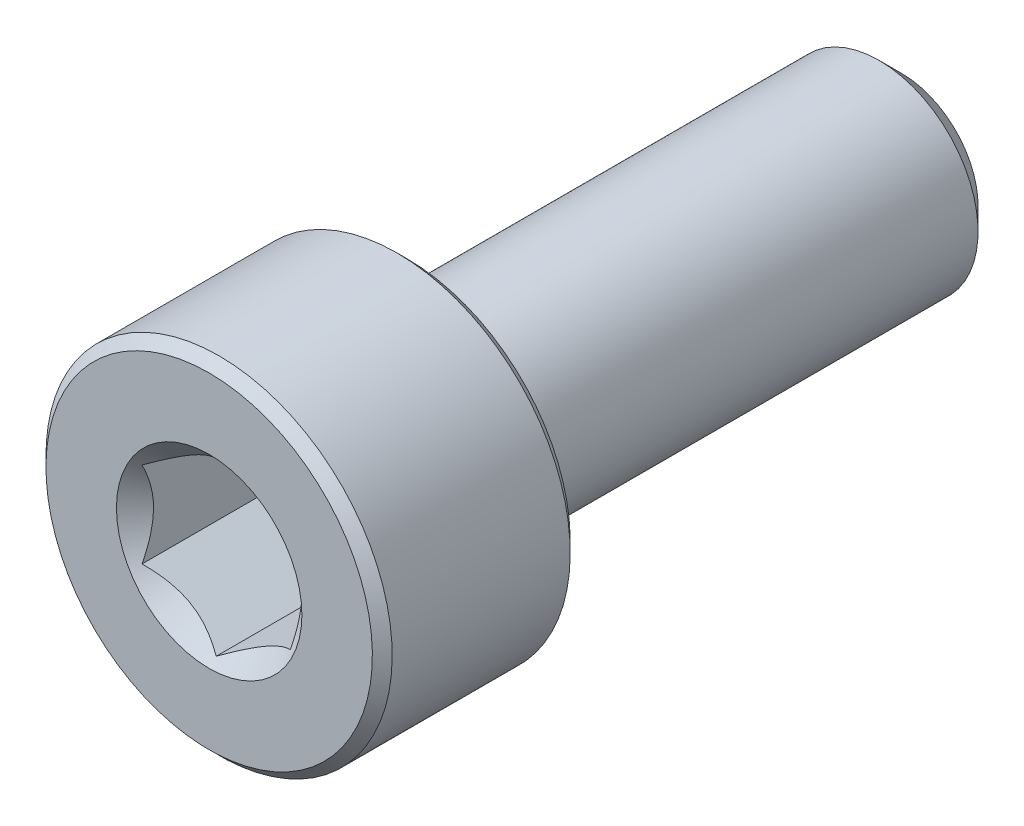
ISO-10303-21;
HEADER;
FILE_DESCRIPTION(('STEP AP214'),'2;1');
FILE_NAME('part.step','',(''),(''),'','','');
FILE_SCHEMA(('AUTOMOTIVE_DESIGN { 1 0 10303 214 1 1 1 1 }'));
ENDSEC;
DATA;
#1=APPLICATION_CONTEXT('core data for automotive mechanical design processes');
#2=APPLICATION_PROTOCOL_DEFINITION('international standard','automotive_design',2000,#1);
#3=PRODUCT_CONTEXT('',#1,'mechanical');
#4=PRODUCT('Part','Part','',(#3));
#5=PRODUCT_RELATED_PRODUCT_CATEGORY('part','',(#4));
#6=PRODUCT_DEFINITION_FORMATION('','',#4);
#7=PRODUCT_DEFINITION_CONTEXT('part definition',#1,'design');
#8=PRODUCT_DEFINITION('design','',#6,#7);
#9=PRODUCT_DEFINITION_SHAPE('','',#8);
#10=(LENGTH_UNIT() NAMED_UNIT(*) SI_UNIT(.MILLI.,.METRE.));
#11=(NAMED_UNIT(*) PLANE_ANGLE_UNIT() SI_UNIT($,.RADIAN.));
#12=(NAMED_UNIT(*) SI_UNIT($,.STERADIAN.) SOLID_ANGLE_UNIT());
#13=UNCERTAINTY_MEASURE_WITH_UNIT(LENGTH_MEASURE(1.E-05),#10,'distance_accuracy_value','');
#14=(GEOMETRIC_REPRESENTATION_CONTEXT(3) GLOBAL_UNCERTAINTY_ASSIGNED_CONTEXT((#13)) GLOBAL_UNIT_ASSIGNED_CONTEXT((#10,
#11,#12)) REPRESENTATION_CONTEXT('',''));
#15=CARTESIAN_POINT('',(0.,0.,0.));
#16=DIRECTION('',(0.,0.,1.));
#17=DIRECTION('',(1.,0.,0.));
#18=AXIS2_PLACEMENT_3D('',#15,#16,#17);
#19=CARTESIAN_POINT('',(0.,1.54533666301317,-7.));
#20=DIRECTION('',(0.,0.,-1.));
#21=DIRECTION('',(0.,1.,0.));
#22=AXIS2_PLACEMENT_3D('',#19,#20,#21);
#23=PLANE('',#22);
#24=CARTESIAN_POINT('',(0.,0.,-7.));
#25=DIRECTION('',(0.,0.,-1.));
#26=DIRECTION('',(0.,1.,0.));
#27=AXIS2_PLACEMENT_3D('',#24,#25,#26);
#28=CIRCLE('',#27,1.54533666301317);
#29=CARTESIAN_POINT('',(0.,1.54533666301317,-7.));
#30=VERTEX_POINT('',#29);
#31=EDGE_CURVE('E54',#30,#30,#28,.T.);
#32=ORIENTED_EDGE('',*,*,#31,.T.);
#33=EDGE_LOOP('',(#32));
#34=FACE_BOUND('',#33,.T.);
#35=ADVANCED_FACE('F41',(#34),#23,.T.);
#36=CARTESIAN_POINT('',(0.,0.,-7.));
#37=DIRECTION('',(0.,0.,1.));
#38=DIRECTION('',(0.,-1.,0.));
#39=AXIS2_PLACEMENT_3D('',#36,#37,#38);
#40=CONICAL_SURFACE('',#39,1.54533666301317,0.785398163397446);
#41=CARTESIAN_POINT('',(0.,0.,-6.54533666301317));
#42=DIRECTION('',(0.,0.,-1.));
#43=DIRECTION('',(0.,1.,0.));
#44=AXIS2_PLACEMENT_3D('',#41,#42,#43);
#45=CIRCLE('',#44,2.);
#46=CARTESIAN_POINT('',(0.,2.,-6.54533666301317));
#47=VERTEX_POINT('',#46);
#48=EDGE_CURVE('E157',#47,#47,#45,.T.);
#49=ORIENTED_EDGE('',*,*,#48,.T.);
#50=EDGE_LOOP('',(#49));
#51=FACE_BOUND('',#50,.T.);
#52=ORIENTED_EDGE('',*,*,#31,.F.);
#53=EDGE_LOOP('',(#52));
#54=FACE_BOUND('',#53,.T.);
#55=ADVANCED_FACE('F163',(#51,#54),#40,.T.);
#56=CARTESIAN_POINT('',(0.,0.,-7.));
#57=DIRECTION('',(0.,0.,-1.));
#58=DIRECTION('',(0.,1.,0.));
#59=AXIS2_PLACEMENT_3D('',#56,#57,#58);
#60=CYLINDRICAL_SURFACE('',#59,2.);
#61=CARTESIAN_POINT('',(0.,0.,2.8));
#62=DIRECTION('',(0.,0.,-1.));
#63=DIRECTION('',(0.,1.,0.));
#64=AXIS2_PLACEMENT_3D('',#61,#62,#63);
#65=CIRCLE('',#64,2.);
#66=CARTESIAN_POINT('',(0.,2.,2.8));
#67=VERTEX_POINT('',#66);
#68=EDGE_CURVE('E154',#67,#67,#65,.T.);
#69=ORIENTED_EDGE('',*,*,#68,.T.);
#70=EDGE_LOOP('',(#69));
#71=FACE_BOUND('',#70,.T.);
#72=ORIENTED_EDGE('',*,*,#48,.F.);
#73=EDGE_LOOP('',(#72));
#74=FACE_BOUND('',#73,.T.);
#75=ADVANCED_FACE('F165',(#71,#74),#60,.T.);
#76=CARTESIAN_POINT('',(0.,0.,2.8));
#77=DIRECTION('',(0.,0.,-1.));
#78=DIRECTION('',(0.,1.,0.));
#79=AXIS2_PLACEMENT_3D('',#76,#77,#78);
#80=TOROIDAL_SURFACE('',#79,2.2,0.199999999999999);
#81=CARTESIAN_POINT('',(0.,0.,3.));
#82=DIRECTION('',(0.,0.,-1.));
#83=DIRECTION('',(0.,1.,0.));
#84=AXIS2_PLACEMENT_3D('',#81,#82,#83);
#85=CIRCLE('',#84,2.2);
#86=CARTESIAN_POINT('',(0.,2.2,3.));
#87=VERTEX_POINT('',#86);
#88=EDGE_CURVE('E151',#87,#87,#85,.T.);
#89=ORIENTED_EDGE('',*,*,#88,.T.);
#90=EDGE_LOOP('',(#89));
#91=FACE_BOUND('',#90,.T.);
#92=ORIENTED_EDGE('',*,*,#68,.F.);
#93=EDGE_LOOP('',(#92));
#94=FACE_BOUND('',#93,.T.);
#95=ADVANCED_FACE('F171',(#91,#94),#80,.F.);
#96=CARTESIAN_POINT('',(0.,3.3,3.));
#97=DIRECTION('',(0.,0.,-1.));
#98=DIRECTION('',(0.,1.,0.));
#99=AXIS2_PLACEMENT_3D('',#96,#97,#98);
#100=PLANE('',#99);
#101=CARTESIAN_POINT('',(0.,0.,3.));
#102=DIRECTION('',(0.,0.,-1.));
#103=DIRECTION('',(0.,1.,0.));
#104=AXIS2_PLACEMENT_3D('',#101,#102,#103);
#105=CIRCLE('',#104,3.3);
#106=CARTESIAN_POINT('',(0.,3.3,3.));
#107=VERTEX_POINT('',#106);
#108=EDGE_CURVE('E148',#107,#107,#105,.T.);
#109=ORIENTED_EDGE('',*,*,#108,.T.);
#110=EDGE_LOOP('',(#109));
#111=FACE_BOUND('',#110,.T.);
#112=ORIENTED_EDGE('',*,*,#88,.F.);
#113=EDGE_LOOP('',(#112));
#114=FACE_BOUND('',#113,.T.);
#115=ADVANCED_FACE('F177',(#111,#114),#100,.T.);
#116=CARTESIAN_POINT('',(0.,0.,3.));
#117=DIRECTION('',(0.,0.,1.));
#118=DIRECTION('',(0.,-1.,0.));
#119=AXIS2_PLACEMENT_3D('',#116,#117,#118);
#120=CONICAL_SURFACE('',#119,3.3,0.785398163397447);
#121=CARTESIAN_POINT('',(0.,0.,3.2));
#122=DIRECTION('',(0.,0.,-1.));
#123=DIRECTION('',(0.,1.,0.));
#124=AXIS2_PLACEMENT_3D('',#121,#122,#123);
#125=CIRCLE('',#124,3.5);
#126=CARTESIAN_POINT('',(0.,3.5,3.2));
#127=VERTEX_POINT('',#126);
#128=EDGE_CURVE('E145',#127,#127,#125,.T.);
#129=ORIENTED_EDGE('',*,*,#128,.T.);
#130=EDGE_LOOP('',(#129));
#131=FACE_BOUND('',#130,.T.);
#132=ORIENTED_EDGE('',*,*,#108,.F.);
#133=EDGE_LOOP('',(#132));
#134=FACE_BOUND('',#133,.T.);
#135=ADVANCED_FACE('F181',(#131,#134),#120,.T.);
#136=CARTESIAN_POINT('',(0.,0.,-7.));
#137=DIRECTION('',(0.,0.,-1.));
#138=DIRECTION('',(0.,1.,0.));
#139=AXIS2_PLACEMENT_3D('',#136,#137,#138);
#140=CYLINDRICAL_SURFACE('',#139,3.5);
#141=CARTESIAN_POINT('',(0.,0.,6.8));
#142=DIRECTION('',(0.,0.,-1.));
#143=DIRECTION('',(0.,1.,0.));
#144=AXIS2_PLACEMENT_3D('',#141,#142,#143);
#145=CIRCLE('',#144,3.5);
#146=CARTESIAN_POINT('',(0.,3.5,6.8));
#147=VERTEX_POINT('',#146);
#148=EDGE_CURVE('E142',#147,#147,#145,.T.);
#149=ORIENTED_EDGE('',*,*,#148,.T.);
#150=EDGE_LOOP('',(#149));
#151=FACE_BOUND('',#150,.T.);
#152=ORIENTED_EDGE('',*,*,#128,.F.);
#153=EDGE_LOOP('',(#152));
#154=FACE_BOUND('',#153,.T.);
#155=ADVANCED_FACE('F185',(#151,#154),#140,.T.);
#156=CARTESIAN_POINT('',(0.,0.,6.8));
#157=DIRECTION('',(0.,0.,-1.));
#158=DIRECTION('',(0.,1.,0.));
#159=AXIS2_PLACEMENT_3D('',#156,#157,#158);
#160=CONICAL_SURFACE('',#159,3.5,0.785398163397447);
#161=CARTESIAN_POINT('',(0.,0.,7.));
#162=DIRECTION('',(0.,0.,-1.));
#163=DIRECTION('',(0.,1.,0.));
#164=AXIS2_PLACEMENT_3D('',#161,#162,#163);
#165=CIRCLE('',#164,3.3);
#166=CARTESIAN_POINT('',(0.,3.3,7.));
#167=VERTEX_POINT('',#166);
#168=EDGE_CURVE('E139',#167,#167,#165,.T.);
#169=ORIENTED_EDGE('',*,*,#168,.T.);
#170=EDGE_LOOP('',(#169));
#171=FACE_BOUND('',#170,.T.);
#172=ORIENTED_EDGE('',*,*,#148,.F.);
#173=EDGE_LOOP('',(#172));
#174=FACE_BOUND('',#173,.T.);
#175=ADVANCED_FACE('F189',(#171,#174),#160,.T.);
#176=CARTESIAN_POINT('',(0.,0.,7.));
#177=DIRECTION('',(0.,0.,1.));
#178=DIRECTION('',(0.,-1.,0.));
#179=AXIS2_PLACEMENT_3D('',#176,#177,#178);
#180=PLANE('',#179);
#181=CARTESIAN_POINT('',(0.,0.,7.));
#182=DIRECTION('',(0.,0.,1.));
#183=DIRECTION('',(1.,0.,0.));
#184=AXIS2_PLACEMENT_3D('',#181,#182,#183);
#185=CIRCLE('',#184,1.875);
#186=CARTESIAN_POINT('',(1.875,0.,7.));
#187=VERTEX_POINT('',#186);
#188=EDGE_CURVE('E113',#187,#187,#185,.T.);
#189=ORIENTED_EDGE('',*,*,#188,.F.);
#190=EDGE_LOOP('',(#189));
#191=FACE_BOUND('',#190,.T.);
#192=ORIENTED_EDGE('',*,*,#168,.F.);
#193=EDGE_LOOP('',(#192));
#194=FACE_BOUND('',#193,.T.);
#195=ADVANCED_FACE('F193',(#191,#194),#180,.T.);
#196=CARTESIAN_POINT('',(0.,0.,7.));
#197=DIRECTION('',(0.,0.,1.));
#198=DIRECTION('',(1.,0.,0.));
#199=AXIS2_PLACEMENT_3D('',#196,#197,#198);
#200=CONICAL_SURFACE('',#199,1.875,0.78539816339745);
#201=ORIENTED_EDGE('',*,*,#188,.T.);
#202=EDGE_LOOP('',(#201));
#203=FACE_BOUND('',#202,.T.);
#204=CARTESIAN_POINT('',(-0.000200000000000217,-1.73216627762272,6.85716628916895));
#205=CARTESIAN_POINT('',(0.0513677907370753,-1.70239359975915,6.82741628363621));
#206=CARTESIAN_POINT('',(0.103797917665201,-1.67212305186355,6.79941329147919));
#207=CARTESIAN_POINT('',(0.210709034055597,-1.61039789003619,6.74814003800902));
#208=CARTESIAN_POINT('',(0.265200195814661,-1.57893740312614,6.72489831261325));
#209=CARTESIAN_POINT('',(0.375079081357249,-1.51549879897987,6.6850845365611));
#210=CARTESIAN_POINT('',(0.4304388090952,-1.4835368452681,6.66841239323977));
#211=CARTESIAN_POINT('',(0.542377257477151,-1.41890915196211,6.64272526438698));
#212=CARTESIAN_POINT('',(0.598952556553009,-1.38624538781118,6.63369109804774));
#213=CARTESIAN_POINT('',(0.696455389516442,-1.32995210095299,6.62553988879573));
#214=CARTESIAN_POINT('',(0.737256908280467,-1.30639533311124,6.6243330605581));
#215=CARTESIAN_POINT('',(0.818787969615859,-1.25932335290193,6.62636486473115));
#216=CARTESIAN_POINT('',(0.859517494314631,-1.23580815085313,6.62960447831719));
#217=CARTESIAN_POINT('',(0.940584402163417,-1.18900414978427,6.64034279355084));
#218=CARTESIAN_POINT('',(0.980921384598289,-1.16571558211719,6.64784546058761));
#219=CARTESIAN_POINT('',(1.06091833691403,-1.11952932016335,6.66670241949717));
#220=CARTESIAN_POINT('',(1.10057800851621,-1.09663179808786,6.67805836458746));
#221=CARTESIAN_POINT('',(1.20216313477449,-1.03798159809698,6.71177245516155));
#222=CARTESIAN_POINT('',(1.26345855370969,-1.00259267147465,6.73667265666225));
#223=CARTESIAN_POINT('',(1.35358562846331,-0.950557780604374,6.77870746084045));
#224=CARTESIAN_POINT('',(1.38328513990772,-0.933410759677147,6.79347596112797));
#225=CARTESIAN_POINT('',(1.44213790138375,-0.899432101996407,6.82436137350905));
#226=CARTESIAN_POINT('',(1.47129140422064,-0.88260031928571,6.84047764169059));
#227=CARTESIAN_POINT('',(1.5002,-0.865909933730601,6.85716628916895));
#228=B_SPLINE_CURVE_WITH_KNOTS('',3,(#204,#205,#206,#207,#208,#209,#210,#211,#212,#213,#214,
#215,#216,#217,#218,#219,#220,#221,#222,#223,#224,#225,#226,#227),.UNSPECIFIED.,.F.,.F.,(4,2,2,
2,2,2,2,2,2,2,2,4),(0.,0.199829143693305,0.400822987382389,0.598623720538182,0.795926240188891,
0.937113067959883,1.07833105577193,1.21968061668222,1.36109089931055,1.58570969637566,
1.69770705470964,1.80965120737194),.UNSPECIFIED.);
#229=CARTESIAN_POINT('',(0.,-1.73205080756888,6.85705080756888));
#230=VERTEX_POINT('',#229);
#231=CARTESIAN_POINT('',(1.5,-0.866025403784439,6.85705080756888));
#232=VERTEX_POINT('',#231);
#233=EDGE_CURVE('E12',#230,#232,#228,.T.);
#234=ORIENTED_EDGE('',*,*,#233,.F.);
#235=CARTESIAN_POINT('',(-1.5002,-0.865909933730601,6.85716628916895));
#236=CARTESIAN_POINT('',(-1.44863220926292,-0.895682611594166,6.82741628363621));
#237=CARTESIAN_POINT('',(-1.3962020823348,-0.925953159489765,6.79941329147919));
#238=CARTESIAN_POINT('',(-1.2892909659444,-0.987678321317123,6.74814003800902));
#239=CARTESIAN_POINT('',(-1.23479980418534,-1.01913880822717,6.72489831261325));
#240=CARTESIAN_POINT('',(-1.12492091864275,-1.08257741237344,6.6850845365611));
#241=CARTESIAN_POINT('',(-1.0695611909048,-1.11453936608521,6.66841239323977));
#242=CARTESIAN_POINT('',(-0.957622742522849,-1.1791670593912,6.64272526438698));
#243=CARTESIAN_POINT('',(-0.901047443446991,-1.21183082354213,6.63369109804774));
#244=CARTESIAN_POINT('',(-0.803544610483559,-1.26812411040032,6.62553988879573));
#245=CARTESIAN_POINT('',(-0.762743091719534,-1.29168087824208,6.62433306055809));
#246=CARTESIAN_POINT('',(-0.681212030384142,-1.33875285845138,6.62636486473115));
#247=CARTESIAN_POINT('',(-0.64048250568537,-1.36226806050018,6.62960447831719));
#248=CARTESIAN_POINT('',(-0.559415597836584,-1.40907206156905,6.64034279355084));
#249=CARTESIAN_POINT('',(-0.519078615401712,-1.43236062923612,6.64784546058761));
#250=CARTESIAN_POINT('',(-0.439081663085969,-1.47854689118996,6.66670241949717));
#251=CARTESIAN_POINT('',(-0.399421991483792,-1.50144441326545,6.67805836458746));
#252=CARTESIAN_POINT('',(-0.297836865225515,-1.56009461325633,6.71177245516155));
#253=CARTESIAN_POINT('',(-0.236541446290311,-1.59548353987866,6.73667265666225));
#254=CARTESIAN_POINT('',(-0.146414371536686,-1.64751843074894,6.77870746084045));
#255=CARTESIAN_POINT('',(-0.116714860092282,-1.66466545167617,6.79347596112797));
#256=CARTESIAN_POINT('',(-0.0578620986162489,-1.69864410935691,6.82436137350905));
#257=CARTESIAN_POINT('',(-0.0287085957793628,-1.71547589206761,6.84047764169059));
#258=CARTESIAN_POINT('',(0.000199999999999868,-1.73216627762272,6.85716628916895));
#259=B_SPLINE_CURVE_WITH_KNOTS('',3,(#235,#236,#237,#238,#239,#240,#241,#242,#243,#244,#245,
#246,#247,#248,#249,#250,#251,#252,#253,#254,#255,#256,#257,#258),.UNSPECIFIED.,.F.,.F.,(4,2,2,
2,2,2,2,2,2,2,2,4),(0.,0.199829143693305,0.400822987382388,0.59862372053818,0.795926240188889,
0.937113067959881,1.07833105577193,1.21968061668222,1.36109089931054,1.58570969637565,
1.69770705470964,1.80965120737194),.UNSPECIFIED.);
#260=CARTESIAN_POINT('',(-1.5,-0.866025403784439,6.85705080756888));
#261=VERTEX_POINT('',#260);
#262=EDGE_CURVE('E99',#261,#230,#259,.T.);
#263=ORIENTED_EDGE('',*,*,#262,.F.);
#264=CARTESIAN_POINT('',(-1.5,-1.82724616303013,7.4890703331983));
#265=CARTESIAN_POINT('',(-1.5,-1.78317586660663,7.45501239995677));
#266=CARTESIAN_POINT('',(-1.5,-1.73887128511932,7.4212586157948));
#267=CARTESIAN_POINT('',(-1.5,-1.64969483826883,7.35448777226094));
#268=CARTESIAN_POINT('',(-1.5,-1.60482284303167,7.32147088651893));
#269=CARTESIAN_POINT('',(-1.5,-1.46855205058729,7.22324713276));
#270=CARTESIAN_POINT('',(-1.5,-1.37616527732981,7.15938887980909));
#271=CARTESIAN_POINT('',(-1.5,-1.18175814530896,7.03306555241423));
#272=CARTESIAN_POINT('',(-1.5,-1.07950173722928,6.97096001610314));
#273=CARTESIAN_POINT('',(-1.5,-0.869762030917011,6.85669692365493));
#274=CARTESIAN_POINT('',(-1.5,-0.762297993140727,6.8045057692236));
#275=CARTESIAN_POINT('',(-1.5,-0.601919355462973,6.74062745548581));
#276=CARTESIAN_POINT('',(-1.5,-0.551595099321827,6.72247344848169));
#277=CARTESIAN_POINT('',(-1.5,-0.449644044337812,6.69019628138117));
#278=CARTESIAN_POINT('',(-1.5,-0.398017164202741,6.67607337353211));
#279=CARTESIAN_POINT('',(-1.5,-0.294682921970128,6.65286025130534));
#280=CARTESIAN_POINT('',(-1.5,-0.242996732973226,6.64367732834991));
#281=CARTESIAN_POINT('',(-1.5,-0.138960185913601,6.63054010534325));
#282=CARTESIAN_POINT('',(-1.5,-0.0866099744987001,6.62658467043386));
#283=CARTESIAN_POINT('',(-1.5,0.0158213358469601,6.62424944439602));
#284=CARTESIAN_POINT('',(-1.5,0.0658968533581893,6.62562321720099));
#285=CARTESIAN_POINT('',(-1.5,0.165665754885722,6.63330038456716));
#286=CARTESIAN_POINT('',(-1.5,0.215359104450809,6.63960421841715));
#287=CARTESIAN_POINT('',(-1.5,0.314848006923591,6.65688863172927));
#288=CARTESIAN_POINT('',(-1.5,0.364628847818078,6.66795253034827));
#289=CARTESIAN_POINT('',(-1.5,0.463087713283466,6.69413916239748));
#290=CARTESIAN_POINT('',(-1.5,0.511765792737121,6.7092616933524));
#291=CARTESIAN_POINT('',(-1.5,0.660788843897246,6.76136082058242));
#292=CARTESIAN_POINT('',(-1.5,0.759116657247093,6.80408886600696));
#293=CARTESIAN_POINT('',(-1.5,0.951184482463469,6.8991892536357));
#294=CARTESIAN_POINT('',(-1.5,1.04490689498041,6.95159542441679));
#295=CARTESIAN_POINT('',(-1.5,1.22407036992814,7.05981955502163));
#296=CARTESIAN_POINT('',(-1.5,1.30969196520694,7.11534242328386));
#297=CARTESIAN_POINT('',(-1.5,1.43583732283972,7.20122204414168));
#298=CARTESIAN_POINT('',(-1.5,1.47734359009407,7.23016065506323));
#299=CARTESIAN_POINT('',(-1.5,1.5597863256648,7.28881558305804));
#300=CARTESIAN_POINT('',(-1.5,1.60072294793761,7.31853168349227));
#301=CARTESIAN_POINT('',(-1.5,1.64142194027434,7.34857054891766));
#302=B_SPLINE_CURVE_WITH_KNOTS('',3,(#264,#265,#266,#267,#268,#269,#270,#271,#272,#273,#274,
#275,#276,#277,#278,#279,#280,#281,#282,#283,#284,#285,#286,#287,#288,#289,#290,#291,#292,#293,
#294,#295,#296,#297,#298,#299,#300,#301),.UNSPECIFIED.,.F.,.F.,(4,2,2,2,2,2,2,2,2,2,2,2,2,2,2,2,
2,2,4),(0.,0.16708643660166,0.33421183555128,0.671001298251587,1.02965358816391,
1.38706788816987,1.54743005800718,1.70780226036013,1.86504930542637,2.02226220743606,
2.17229379545786,2.32233875343611,2.47512433054573,2.62790228697088,2.94859878977715,
3.27043822191845,3.57642907004227,3.72821874189076,3.87996656039158),.UNSPECIFIED.);
#303=CARTESIAN_POINT('',(-1.5,0.866025403784438,6.85705080756888));
#304=VERTEX_POINT('',#303);
#305=EDGE_CURVE('E112',#304,#261,#302,.F.);
#306=ORIENTED_EDGE('',*,*,#305,.F.);
#307=CARTESIAN_POINT('',(0.000199999999999728,1.73216627762271,6.85716628916895));
#308=CARTESIAN_POINT('',(-0.0513677907370758,1.70239359975915,6.8274162836362));
#309=CARTESIAN_POINT('',(-0.103797917665201,1.67212305186355,6.79941329147919));
#310=CARTESIAN_POINT('',(-0.210709034055597,1.61039789003619,6.74814003800902));
#311=CARTESIAN_POINT('',(-0.265200195814662,1.57893740312614,6.72489831261325));
#312=CARTESIAN_POINT('',(-0.375079081357249,1.51549879897987,6.6850845365611));
#313=CARTESIAN_POINT('',(-0.4304388090952,1.4835368452681,6.66841239323977));
#314=CARTESIAN_POINT('',(-0.542377257477151,1.41890915196211,6.64272526438698));
#315=CARTESIAN_POINT('',(-0.598952556553009,1.38624538781118,6.63369109804774));
#316=CARTESIAN_POINT('',(-0.696455389516442,1.32995210095299,6.62553988879573));
#317=CARTESIAN_POINT('',(-0.737256908280467,1.30639533311124,6.62433306055809));
#318=CARTESIAN_POINT('',(-0.818787969615859,1.25932335290193,6.62636486473115));
#319=CARTESIAN_POINT('',(-0.859517494314631,1.23580815085313,6.62960447831719));
#320=CARTESIAN_POINT('',(-0.940584402163417,1.18900414978426,6.64034279355084));
#321=CARTESIAN_POINT('',(-0.980921384598289,1.16571558211719,6.64784546058761));
#322=CARTESIAN_POINT('',(-1.06091833691403,1.11952932016335,6.66670241949717));
#323=CARTESIAN_POINT('',(-1.10057800851621,1.09663179808786,6.67805836458746));
#324=CARTESIAN_POINT('',(-1.20216313477449,1.03798159809698,6.71177245516155));
#325=CARTESIAN_POINT('',(-1.26345855370969,1.00259267147465,6.73667265666225));
#326=CARTESIAN_POINT('',(-1.35358562846331,0.950557780604374,6.77870746084045));
#327=CARTESIAN_POINT('',(-1.38328513990772,0.933410759677147,6.79347596112797));
#328=CARTESIAN_POINT('',(-1.44213790138375,0.899432101996407,6.82436137350905));
#329=CARTESIAN_POINT('',(-1.47129140422064,0.88260031928571,6.84047764169059));
#330=CARTESIAN_POINT('',(-1.5002,0.8659099337306,6.85716628916895));
#331=B_SPLINE_CURVE_WITH_KNOTS('',3,(#307,#308,#309,#310,#311,#312,#313,#314,#315,#316,#317,
#318,#319,#320,#321,#322,#323,#324,#325,#326,#327,#328,#329,#330),.UNSPECIFIED.,.F.,.F.,(4,2,2,
2,2,2,2,2,2,2,2,4),(0.,0.199829143693305,0.400822987382389,0.598623720538182,0.79592624018889,
0.937113067959882,1.07833105577193,1.21968061668222,1.36109089931055,1.58570969637566,
1.69770705470964,1.80965120737194),.UNSPECIFIED.);
#332=CARTESIAN_POINT('',(0.,1.73205080756888,6.85705080756888));
#333=VERTEX_POINT('',#332);
#334=EDGE_CURVE('E243',#333,#304,#331,.T.);
#335=ORIENTED_EDGE('',*,*,#334,.F.);
#336=CARTESIAN_POINT('',(1.5002,0.865909933730601,6.85716628916895));
#337=CARTESIAN_POINT('',(1.44863220926292,0.895682611594165,6.82741628363621));
#338=CARTESIAN_POINT('',(1.3962020823348,0.925953159489765,6.79941329147919));
#339=CARTESIAN_POINT('',(1.2892909659444,0.987678321317123,6.74814003800902));
#340=CARTESIAN_POINT('',(1.23479980418534,1.01913880822717,6.72489831261325));
#341=CARTESIAN_POINT('',(1.12492091864275,1.08257741237344,6.6850845365611));
#342=CARTESIAN_POINT('',(1.0695611909048,1.11453936608521,6.66841239323977));
#343=CARTESIAN_POINT('',(0.957622742522849,1.1791670593912,6.64272526438698));
#344=CARTESIAN_POINT('',(0.901047443446991,1.21183082354213,6.63369109804774));
#345=CARTESIAN_POINT('',(0.803544610483559,1.26812411040032,6.62553988879573));
#346=CARTESIAN_POINT('',(0.762743091719533,1.29168087824208,6.62433306055809));
#347=CARTESIAN_POINT('',(0.681212030384141,1.33875285845138,6.62636486473115));
#348=CARTESIAN_POINT('',(0.640482505685369,1.36226806050018,6.62960447831718));
#349=CARTESIAN_POINT('',(0.559415597836583,1.40907206156905,6.64034279355084));
#350=CARTESIAN_POINT('',(0.519078615401712,1.43236062923612,6.64784546058761));
#351=CARTESIAN_POINT('',(0.439081663085969,1.47854689118996,6.66670241949717));
#352=CARTESIAN_POINT('',(0.399421991483792,1.50144441326545,6.67805836458746));
#353=CARTESIAN_POINT('',(0.297836865225514,1.56009461325633,6.71177245516155));
#354=CARTESIAN_POINT('',(0.23654144629031,1.59548353987866,6.73667265666224));
#355=CARTESIAN_POINT('',(0.146414371536686,1.64751843074894,6.77870746084045));
#356=CARTESIAN_POINT('',(0.116714860092282,1.66466545167617,6.79347596112797));
#357=CARTESIAN_POINT('',(0.0578620986162486,1.69864410935691,6.82436137350905));
#358=CARTESIAN_POINT('',(0.0287085957793623,1.71547589206761,6.84047764169059));
#359=CARTESIAN_POINT('',(-0.000200000000000577,1.73216627762271,6.85716628916895));
#360=B_SPLINE_CURVE_WITH_KNOTS('',3,(#336,#337,#338,#339,#340,#341,#342,#343,#344,#345,#346,
#347,#348,#349,#350,#351,#352,#353,#354,#355,#356,#357,#358,#359),.UNSPECIFIED.,.F.,.F.,(4,2,2,
2,2,2,2,2,2,2,2,4),(0.,0.199829143693304,0.400822987382389,0.598623720538182,0.79592624018889,
0.937113067959882,1.07833105577193,1.21968061668222,1.36109089931054,1.58570969637565,
1.69770705470964,1.80965120737194),.UNSPECIFIED.);
#361=CARTESIAN_POINT('',(1.5,0.866025403784438,6.85705080756888));
#362=VERTEX_POINT('',#361);
#363=EDGE_CURVE('E216',#362,#333,#360,.T.);
#364=ORIENTED_EDGE('',*,*,#363,.F.);
#365=CARTESIAN_POINT('',(1.5,-1.82724616303013,7.4890703331983));
#366=CARTESIAN_POINT('',(1.5,-1.78317586660663,7.45501239995677));
#367=CARTESIAN_POINT('',(1.5,-1.73887128511932,7.4212586157948));
#368=CARTESIAN_POINT('',(1.5,-1.64969483826883,7.35448777226094));
#369=CARTESIAN_POINT('',(1.5,-1.60482284303166,7.32147088651893));
#370=CARTESIAN_POINT('',(1.5,-1.46855205058729,7.22324713276));
#371=CARTESIAN_POINT('',(1.5,-1.37616527732981,7.15938887980909));
#372=CARTESIAN_POINT('',(1.5,-1.18175814530896,7.03306555241423));
#373=CARTESIAN_POINT('',(1.5,-1.07950173722928,6.97096001610314));
#374=CARTESIAN_POINT('',(1.5,-0.869762030917009,6.85669692365493));
#375=CARTESIAN_POINT('',(1.5,-0.762297993140726,6.8045057692236));
#376=CARTESIAN_POINT('',(1.5,-0.601919355462973,6.74062745548581));
#377=CARTESIAN_POINT('',(1.5,-0.551595099321827,6.72247344848169));
#378=CARTESIAN_POINT('',(1.5,-0.449644044337812,6.69019628138117));
#379=CARTESIAN_POINT('',(1.5,-0.398017164202741,6.67607337353211));
#380=CARTESIAN_POINT('',(1.5,-0.294682921970128,6.65286025130534));
#381=CARTESIAN_POINT('',(1.5,-0.242996732973227,6.64367732834991));
#382=CARTESIAN_POINT('',(1.5,-0.138960185913602,6.63054010534325));
#383=CARTESIAN_POINT('',(1.5,-0.0866099744987009,6.62658467043386));
#384=CARTESIAN_POINT('',(1.5,0.0158213358469593,6.62424944439602));
#385=CARTESIAN_POINT('',(1.5,0.0658968533581886,6.62562321720099));
#386=CARTESIAN_POINT('',(1.5,0.165665754885722,6.63330038456716));
#387=CARTESIAN_POINT('',(1.5,0.215359104450808,6.63960421841715));
#388=CARTESIAN_POINT('',(1.5,0.314848006923591,6.65688863172927));
#389=CARTESIAN_POINT('',(1.5,0.364628847818077,6.66795253034827));
#390=CARTESIAN_POINT('',(1.5,0.463087713283465,6.69413916239748));
#391=CARTESIAN_POINT('',(1.5,0.511765792737121,6.7092616933524));
#392=CARTESIAN_POINT('',(1.5,0.660788843897245,6.76136082058242));
#393=CARTESIAN_POINT('',(1.5,0.759116657247092,6.80408886600696));
#394=CARTESIAN_POINT('',(1.5,0.951184482463468,6.8991892536357));
#395=CARTESIAN_POINT('',(1.5,1.04490689498041,6.95159542441679));
#396=CARTESIAN_POINT('',(1.5,1.22407036992814,7.05981955502163));
#397=CARTESIAN_POINT('',(1.5,1.30969196520694,7.11534242328386));
#398=CARTESIAN_POINT('',(1.5,1.43583732283972,7.20122204414168));
#399=CARTESIAN_POINT('',(1.5,1.47734359009407,7.23016065506323));
#400=CARTESIAN_POINT('',(1.5,1.55978632566479,7.28881558305803));
#401=CARTESIAN_POINT('',(1.5,1.60072294793761,7.31853168349227));
#402=CARTESIAN_POINT('',(1.5,1.64142194027434,7.34857054891766));
#403=B_SPLINE_CURVE_WITH_KNOTS('',3,(#365,#366,#367,#368,#369,#370,#371,#372,#373,#374,#375,
#376,#377,#378,#379,#380,#381,#382,#383,#384,#385,#386,#387,#388,#389,#390,#391,#392,#393,#394,
#395,#396,#397,#398,#399,#400,#401,#402),.UNSPECIFIED.,.F.,.F.,(4,2,2,2,2,2,2,2,2,2,2,2,2,2,2,2,
2,2,4),(0.,0.16708643660166,0.33421183555128,0.671001298251586,1.02965358816391,
1.38706788816987,1.54743005800718,1.70780226036013,1.86504930542636,2.02226220743606,
2.17229379545786,2.3223387534361,2.47512433054573,2.62790228697088,2.94859878977715,
3.27043822191844,3.57642907004227,3.72821874189075,3.87996656039158),.UNSPECIFIED.);
#404=EDGE_CURVE('E61',#232,#362,#403,.T.);
#405=ORIENTED_EDGE('',*,*,#404,.F.);
#406=EDGE_LOOP('',(#234,#263,#306,#335,#364,#405));
#407=FACE_BOUND('',#406,.T.);
#408=ADVANCED_FACE('F98',(#203,#407),#200,.F.);
#409=CARTESIAN_POINT('',(0.,3.3,4.));
#410=DIRECTION('',(0.,0.,-1.));
#411=DIRECTION('',(0.,1.,0.));
#412=AXIS2_PLACEMENT_3D('',#409,#410,#411);
#413=PLANE('',#412);
#414=DIRECTION('',(0.866025403784439,0.5,0.));
#415=VECTOR('',#414,1.);
#416=CARTESIAN_POINT('',(0.,-1.73205080756888,4.));
#417=LINE('',#416,#415);
#418=CARTESIAN_POINT('',(0.,-1.73205080756888,4.));
#419=VERTEX_POINT('',#418);
#420=CARTESIAN_POINT('',(1.5,-0.866025403784439,4.));
#421=VERTEX_POINT('',#420);
#422=EDGE_CURVE('E116',#419,#421,#417,.T.);
#423=ORIENTED_EDGE('',*,*,#422,.T.);
#424=DIRECTION('',(0.,1.,0.));
#425=VECTOR('',#424,1.);
#426=CARTESIAN_POINT('',(1.5,-0.866025403784439,4.));
#427=LINE('',#426,#425);
#428=CARTESIAN_POINT('',(1.5,0.866025403784438,4.));
#429=VERTEX_POINT('',#428);
#430=EDGE_CURVE('E68',#421,#429,#427,.T.);
#431=ORIENTED_EDGE('',*,*,#430,.T.);
#432=DIRECTION('',(-0.866025403784439,0.5,0.));
#433=VECTOR('',#432,1.);
#434=CARTESIAN_POINT('',(1.5,0.866025403784438,4.));
#435=LINE('',#434,#433);
#436=CARTESIAN_POINT('',(0.,1.73205080756888,4.));
#437=VERTEX_POINT('',#436);
#438=EDGE_CURVE('E124',#429,#437,#435,.T.);
#439=ORIENTED_EDGE('',*,*,#438,.T.);
#440=DIRECTION('',(-0.866025403784439,-0.5,0.));
#441=VECTOR('',#440,1.);
#442=CARTESIAN_POINT('',(0.,1.73205080756888,4.));
#443=LINE('',#442,#441);
#444=CARTESIAN_POINT('',(-1.5,0.866025403784439,4.));
#445=VERTEX_POINT('',#444);
#446=EDGE_CURVE('E131',#437,#445,#443,.T.);
#447=ORIENTED_EDGE('',*,*,#446,.T.);
#448=DIRECTION('',(0.,-1.,0.));
#449=VECTOR('',#448,1.);
#450=CARTESIAN_POINT('',(-1.5,0.866025403784438,4.));
#451=LINE('',#450,#449);
#452=CARTESIAN_POINT('',(-1.5,-0.866025403784439,4.));
#453=VERTEX_POINT('',#452);
#454=EDGE_CURVE('E127',#445,#453,#451,.T.);
#455=ORIENTED_EDGE('',*,*,#454,.T.);
#456=DIRECTION('',(0.866025403784439,-0.5,0.));
#457=VECTOR('',#456,1.);
#458=CARTESIAN_POINT('',(-1.5,-0.866025403784439,4.));
#459=LINE('',#458,#457);
#460=EDGE_CURVE('E117',#453,#419,#459,.T.);
#461=ORIENTED_EDGE('',*,*,#460,.T.);
#462=EDGE_LOOP('',(#423,#431,#439,#447,#455,#461));
#463=FACE_BOUND('',#462,.T.);
#464=ADVANCED_FACE('F198',(#463),#413,.F.);
#465=CARTESIAN_POINT('',(0.,-1.73205080756888,-1.58257569495584));
#466=DIRECTION('',(0.5,-0.866025403784439,0.));
#467=DIRECTION('',(0.866025403784439,0.5,0.));
#468=AXIS2_PLACEMENT_3D('',#465,#466,#467);
#469=PLANE('',#468);
#470=DIRECTION('',(0.,0.,1.));
#471=VECTOR('',#470,1.);
#472=CARTESIAN_POINT('',(0.,-1.73205080756888,-1.58257569495584));
#473=LINE('',#472,#471);
#474=EDGE_CURVE('E108',#419,#230,#473,.T.);
#475=ORIENTED_EDGE('',*,*,#474,.T.);
#476=ORIENTED_EDGE('',*,*,#233,.T.);
#477=DIRECTION('',(0.,0.,1.));
#478=VECTOR('',#477,1.);
#479=CARTESIAN_POINT('',(1.5,-0.866025403784439,-1.58257569495584));
#480=LINE('',#479,#478);
#481=EDGE_CURVE('E119',#421,#232,#480,.T.);
#482=ORIENTED_EDGE('',*,*,#481,.F.);
#483=ORIENTED_EDGE('',*,*,#422,.F.);
#484=EDGE_LOOP('',(#475,#476,#482,#483));
#485=FACE_BOUND('',#484,.T.);
#486=ADVANCED_FACE('F115',(#485),#469,.F.);
#487=CARTESIAN_POINT('',(-1.5,-0.866025403784439,-1.58257569495584));
#488=DIRECTION('',(-0.5,-0.866025403784439,0.));
#489=DIRECTION('',(0.866025403784439,-0.5,0.));
#490=AXIS2_PLACEMENT_3D('',#487,#488,#489);
#491=PLANE('',#490);
#492=DIRECTION('',(0.,0.,1.));
#493=VECTOR('',#492,1.);
#494=CARTESIAN_POINT('',(-1.5,-0.866025403784439,-1.58257569495584));
#495=LINE('',#494,#493);
#496=EDGE_CURVE('E111',#453,#261,#495,.T.);
#497=ORIENTED_EDGE('',*,*,#496,.T.);
#498=ORIENTED_EDGE('',*,*,#262,.T.);
#499=ORIENTED_EDGE('',*,*,#474,.F.);
#500=ORIENTED_EDGE('',*,*,#460,.F.);
#501=EDGE_LOOP('',(#497,#498,#499,#500));
#502=FACE_BOUND('',#501,.T.);
#503=ADVANCED_FACE('F107',(#502),#491,.F.);
#504=CARTESIAN_POINT('',(-1.5,0.866025403784438,-1.58257569495584));
#505=DIRECTION('',(-1.,0.,0.));
#506=DIRECTION('',(0.,0.,1.));
#507=AXIS2_PLACEMENT_3D('',#504,#505,#506);
#508=PLANE('',#507);
#509=DIRECTION('',(0.,0.,1.));
#510=VECTOR('',#509,1.);
#511=CARTESIAN_POINT('',(-1.5,0.866025403784438,-1.58257569495584));
#512=LINE('',#511,#510);
#513=EDGE_CURVE('E128',#445,#304,#512,.T.);
#514=ORIENTED_EDGE('',*,*,#513,.T.);
#515=ORIENTED_EDGE('',*,*,#305,.T.);
#516=ORIENTED_EDGE('',*,*,#496,.F.);
#517=ORIENTED_EDGE('',*,*,#454,.F.);
#518=EDGE_LOOP('',(#514,#515,#516,#517));
#519=FACE_BOUND('',#518,.T.);
#520=ADVANCED_FACE('F252',(#519),#508,.F.);
#521=CARTESIAN_POINT('',(0.,1.73205080756888,-1.58257569495584));
#522=DIRECTION('',(-0.5,0.866025403784439,0.));
#523=DIRECTION('',(-0.866025403784439,-0.5,0.));
#524=AXIS2_PLACEMENT_3D('',#521,#522,#523);
#525=PLANE('',#524);
#526=DIRECTION('',(0.,0.,1.));
#527=VECTOR('',#526,1.);
#528=CARTESIAN_POINT('',(0.,1.73205080756888,-1.58257569495584));
#529=LINE('',#528,#527);
#530=EDGE_CURVE('E132',#437,#333,#529,.T.);
#531=ORIENTED_EDGE('',*,*,#530,.T.);
#532=ORIENTED_EDGE('',*,*,#334,.T.);
#533=ORIENTED_EDGE('',*,*,#513,.F.);
#534=ORIENTED_EDGE('',*,*,#446,.F.);
#535=EDGE_LOOP('',(#531,#532,#533,#534));
#536=FACE_BOUND('',#535,.T.);
#537=ADVANCED_FACE('F249',(#536),#525,.F.);
#538=CARTESIAN_POINT('',(1.5,0.866025403784438,-1.58257569495584));
#539=DIRECTION('',(0.5,0.866025403784439,0.));
#540=DIRECTION('',(-0.866025403784439,0.5,0.));
#541=AXIS2_PLACEMENT_3D('',#538,#539,#540);
#542=PLANE('',#541);
#543=DIRECTION('',(0.,0.,1.));
#544=VECTOR('',#543,1.);
#545=CARTESIAN_POINT('',(1.5,0.866025403784438,-1.58257569495584));
#546=LINE('',#545,#544);
#547=EDGE_CURVE('E135',#429,#362,#546,.T.);
#548=ORIENTED_EDGE('',*,*,#547,.T.);
#549=ORIENTED_EDGE('',*,*,#363,.T.);
#550=ORIENTED_EDGE('',*,*,#530,.F.);
#551=ORIENTED_EDGE('',*,*,#438,.F.);
#552=EDGE_LOOP('',(#548,#549,#550,#551));
#553=FACE_BOUND('',#552,.T.);
#554=ADVANCED_FACE('F206',(#553),#542,.F.);
#555=CARTESIAN_POINT('',(1.5,-0.866025403784439,-1.58257569495584));
#556=DIRECTION('',(1.,0.,0.));
#557=DIRECTION('',(0.,0.,-1.));
#558=AXIS2_PLACEMENT_3D('',#555,#556,#557);
#559=PLANE('',#558);
#560=ORIENTED_EDGE('',*,*,#481,.T.);
#561=ORIENTED_EDGE('',*,*,#404,.T.);
#562=ORIENTED_EDGE('',*,*,#547,.F.);
#563=ORIENTED_EDGE('',*,*,#430,.F.);
#564=EDGE_LOOP('',(#560,#561,#562,#563));
#565=FACE_BOUND('',#564,.T.);
#566=ADVANCED_FACE('F202',(#565),#559,.F.);
#567=CLOSED_SHELL('',(#35,#55,#75,#95,#115,#135,#155,#175,#195,#408,#464,#486,#503,#520,#537,
#554,#566));
#568=MANIFOLD_SOLID_BREP('B2',#567);
#569=ADVANCED_BREP_SHAPE_REPRESENTATION('',(#18,#568),#14);
#570=SHAPE_DEFINITION_REPRESENTATION(#9,#569);
ENDSEC;
END-ISO-10303-21;
